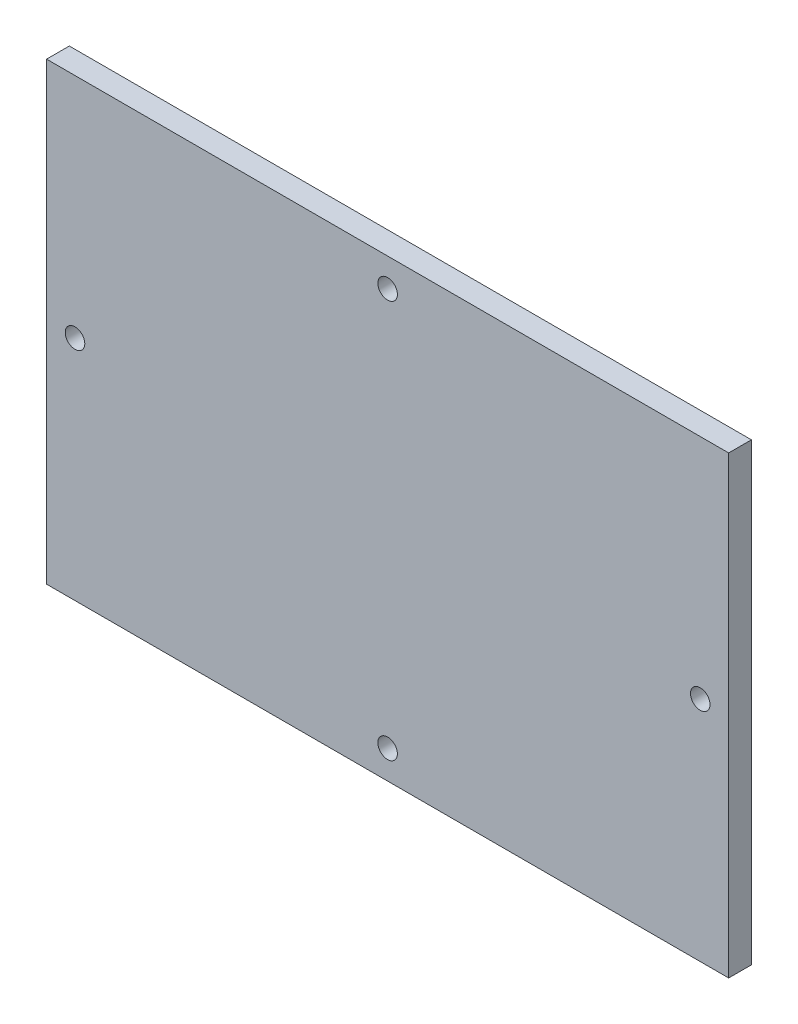
ISO-10303-21;
HEADER;
FILE_DESCRIPTION(('STEP AP214'),'2;1');
FILE_NAME('part.step','',(''),(''),'','','');
FILE_SCHEMA(('AUTOMOTIVE_DESIGN { 1 0 10303 214 1 1 1 1 }'));
ENDSEC;
DATA;
#1=APPLICATION_CONTEXT('core data for automotive mechanical design processes');
#2=APPLICATION_PROTOCOL_DEFINITION('international standard','automotive_design',2000,#1);
#3=PRODUCT_CONTEXT('',#1,'mechanical');
#4=PRODUCT('Part','Part','',(#3));
#5=PRODUCT_RELATED_PRODUCT_CATEGORY('part','',(#4));
#6=PRODUCT_DEFINITION_FORMATION('','',#4);
#7=PRODUCT_DEFINITION_CONTEXT('part definition',#1,'design');
#8=PRODUCT_DEFINITION('design','',#6,#7);
#9=PRODUCT_DEFINITION_SHAPE('','',#8);
#10=(LENGTH_UNIT() NAMED_UNIT(*) SI_UNIT(.MILLI.,.METRE.));
#11=(NAMED_UNIT(*) PLANE_ANGLE_UNIT() SI_UNIT($,.RADIAN.));
#12=(NAMED_UNIT(*) SI_UNIT($,.STERADIAN.) SOLID_ANGLE_UNIT());
#13=UNCERTAINTY_MEASURE_WITH_UNIT(LENGTH_MEASURE(1.E-05),#10,'distance_accuracy_value','');
#14=(GEOMETRIC_REPRESENTATION_CONTEXT(3) GLOBAL_UNCERTAINTY_ASSIGNED_CONTEXT((#13)) GLOBAL_UNIT_ASSIGNED_CONTEXT((#10,
#11,#12)) REPRESENTATION_CONTEXT('',''));
#15=CARTESIAN_POINT('',(0.,0.,0.));
#16=DIRECTION('',(0.,0.,1.));
#17=DIRECTION('',(1.,0.,0.));
#18=AXIS2_PLACEMENT_3D('',#15,#16,#17);
#19=CARTESIAN_POINT('',(-38.1,-25.4,2.54));
#20=DIRECTION('',(1.,0.,0.));
#21=DIRECTION('',(0.,0.,-1.));
#22=AXIS2_PLACEMENT_3D('',#19,#20,#21);
#23=PLANE('',#22);
#24=DIRECTION('',(0.,-1.,0.));
#25=VECTOR('',#24,1.);
#26=CARTESIAN_POINT('',(-38.1,-25.4,0.));
#27=LINE('',#26,#25);
#28=CARTESIAN_POINT('',(-38.1,25.4,0.));
#29=VERTEX_POINT('',#28);
#30=CARTESIAN_POINT('',(-38.1,-25.4,0.));
#31=VERTEX_POINT('',#30);
#32=EDGE_CURVE('E114',#29,#31,#27,.T.);
#33=ORIENTED_EDGE('',*,*,#32,.T.);
#34=DIRECTION('',(0.,0.,-1.));
#35=VECTOR('',#34,1.);
#36=CARTESIAN_POINT('',(-38.1,-25.4,2.54));
#37=LINE('',#36,#35);
#38=CARTESIAN_POINT('',(-38.1,-25.4,2.54));
#39=VERTEX_POINT('',#38);
#40=EDGE_CURVE('E11',#39,#31,#37,.T.);
#41=ORIENTED_EDGE('',*,*,#40,.F.);
#42=DIRECTION('',(0.,-1.,0.));
#43=VECTOR('',#42,1.);
#44=CARTESIAN_POINT('',(-38.1,-25.4,2.54));
#45=LINE('',#44,#43);
#46=CARTESIAN_POINT('',(-38.1,25.4,2.54));
#47=VERTEX_POINT('',#46);
#48=EDGE_CURVE('E100',#47,#39,#45,.T.);
#49=ORIENTED_EDGE('',*,*,#48,.F.);
#50=DIRECTION('',(0.,0.,-1.));
#51=VECTOR('',#50,1.);
#52=CARTESIAN_POINT('',(-38.1,25.4,2.54));
#53=LINE('',#52,#51);
#54=EDGE_CURVE('E108',#47,#29,#53,.T.);
#55=ORIENTED_EDGE('',*,*,#54,.T.);
#56=EDGE_LOOP('',(#33,#41,#49,#55));
#57=FACE_BOUND('',#56,.T.);
#58=ADVANCED_FACE('F44',(#57),#23,.F.);
#59=CARTESIAN_POINT('',(38.1,-25.4,2.54));
#60=DIRECTION('',(0.,1.,0.));
#61=DIRECTION('',(-1.,0.,0.));
#62=AXIS2_PLACEMENT_3D('',#59,#60,#61);
#63=PLANE('',#62);
#64=DIRECTION('',(1.,0.,0.));
#65=VECTOR('',#64,1.);
#66=CARTESIAN_POINT('',(38.1,-25.4,0.));
#67=LINE('',#66,#65);
#68=CARTESIAN_POINT('',(38.1,-25.4,0.));
#69=VERTEX_POINT('',#68);
#70=EDGE_CURVE('E105',#31,#69,#67,.T.);
#71=ORIENTED_EDGE('',*,*,#70,.T.);
#72=DIRECTION('',(0.,0.,-1.));
#73=VECTOR('',#72,1.);
#74=CARTESIAN_POINT('',(38.1,-25.4,2.54));
#75=LINE('',#74,#73);
#76=CARTESIAN_POINT('',(38.1,-25.4,2.54));
#77=VERTEX_POINT('',#76);
#78=EDGE_CURVE('E53',#77,#69,#75,.T.);
#79=ORIENTED_EDGE('',*,*,#78,.F.);
#80=DIRECTION('',(1.,0.,0.));
#81=VECTOR('',#80,1.);
#82=CARTESIAN_POINT('',(38.1,-25.4,2.54));
#83=LINE('',#82,#81);
#84=EDGE_CURVE('E95',#39,#77,#83,.T.);
#85=ORIENTED_EDGE('',*,*,#84,.F.);
#86=ORIENTED_EDGE('',*,*,#40,.T.);
#87=EDGE_LOOP('',(#71,#79,#85,#86));
#88=FACE_BOUND('',#87,.T.);
#89=ADVANCED_FACE('F101',(#88),#63,.F.);
#90=CARTESIAN_POINT('',(38.1,-25.4,2.54));
#91=DIRECTION('',(-1.,0.,0.));
#92=DIRECTION('',(0.,0.,1.));
#93=AXIS2_PLACEMENT_3D('',#90,#91,#92);
#94=PLANE('',#93);
#95=DIRECTION('',(0.,1.,0.));
#96=VECTOR('',#95,1.);
#97=CARTESIAN_POINT('',(38.1,-25.4,0.));
#98=LINE('',#97,#96);
#99=CARTESIAN_POINT('',(38.1,25.4,0.));
#100=VERTEX_POINT('',#99);
#101=EDGE_CURVE('E76',#69,#100,#98,.T.);
#102=ORIENTED_EDGE('',*,*,#101,.T.);
#103=DIRECTION('',(0.,0.,-1.));
#104=VECTOR('',#103,1.);
#105=CARTESIAN_POINT('',(38.1,25.4,2.54));
#106=LINE('',#105,#104);
#107=CARTESIAN_POINT('',(38.1,25.4,2.54));
#108=VERTEX_POINT('',#107);
#109=EDGE_CURVE('E102',#108,#100,#106,.T.);
#110=ORIENTED_EDGE('',*,*,#109,.F.);
#111=DIRECTION('',(0.,1.,0.));
#112=VECTOR('',#111,1.);
#113=CARTESIAN_POINT('',(38.1,-25.4,2.54));
#114=LINE('',#113,#112);
#115=EDGE_CURVE('E92',#77,#108,#114,.T.);
#116=ORIENTED_EDGE('',*,*,#115,.F.);
#117=ORIENTED_EDGE('',*,*,#78,.T.);
#118=EDGE_LOOP('',(#102,#110,#116,#117));
#119=FACE_BOUND('',#118,.T.);
#120=ADVANCED_FACE('F104',(#119),#94,.F.);
#121=CARTESIAN_POINT('',(38.1,25.4,2.54));
#122=DIRECTION('',(0.,-1.,0.));
#123=DIRECTION('',(1.,0.,0.));
#124=AXIS2_PLACEMENT_3D('',#121,#122,#123);
#125=PLANE('',#124);
#126=DIRECTION('',(-1.,0.,0.));
#127=VECTOR('',#126,1.);
#128=CARTESIAN_POINT('',(38.1,25.4,0.));
#129=LINE('',#128,#127);
#130=EDGE_CURVE('E81',#100,#29,#129,.T.);
#131=ORIENTED_EDGE('',*,*,#130,.T.);
#132=ORIENTED_EDGE('',*,*,#54,.F.);
#133=DIRECTION('',(-1.,0.,0.));
#134=VECTOR('',#133,1.);
#135=CARTESIAN_POINT('',(38.1,25.4,2.54));
#136=LINE('',#135,#134);
#137=EDGE_CURVE('E65',#108,#47,#136,.T.);
#138=ORIENTED_EDGE('',*,*,#137,.F.);
#139=ORIENTED_EDGE('',*,*,#109,.T.);
#140=EDGE_LOOP('',(#131,#132,#138,#139));
#141=FACE_BOUND('',#140,.T.);
#142=ADVANCED_FACE('F130',(#141),#125,.F.);
#143=CARTESIAN_POINT('',(0.,0.,2.54));
#144=DIRECTION('',(0.,0.,1.));
#145=DIRECTION('',(1.,0.,0.));
#146=AXIS2_PLACEMENT_3D('',#143,#144,#145);
#147=PLANE('',#146);
#148=CARTESIAN_POINT('',(-34.925,0.,2.54));
#149=DIRECTION('',(0.,0.,1.));
#150=DIRECTION('',(1.,0.,0.));
#151=AXIS2_PLACEMENT_3D('',#148,#149,#150);
#152=CIRCLE('',#151,1.0922);
#153=CARTESIAN_POINT('',(-33.8328,0.,2.54));
#154=VERTEX_POINT('',#153);
#155=EDGE_CURVE('E158',#154,#154,#152,.T.);
#156=ORIENTED_EDGE('',*,*,#155,.F.);
#157=EDGE_LOOP('',(#156));
#158=FACE_BOUND('',#157,.T.);
#159=CARTESIAN_POINT('',(34.925,0.,2.54));
#160=DIRECTION('',(0.,0.,1.));
#161=DIRECTION('',(-1.,0.,0.));
#162=AXIS2_PLACEMENT_3D('',#159,#160,#161);
#163=CIRCLE('',#162,1.0922);
#164=CARTESIAN_POINT('',(33.8328,0.,2.54));
#165=VERTEX_POINT('',#164);
#166=EDGE_CURVE('E152',#165,#165,#163,.T.);
#167=ORIENTED_EDGE('',*,*,#166,.F.);
#168=EDGE_LOOP('',(#167));
#169=FACE_BOUND('',#168,.T.);
#170=CARTESIAN_POINT('',(0.,-22.225,2.54));
#171=DIRECTION('',(0.,0.,1.));
#172=DIRECTION('',(1.,0.,0.));
#173=AXIS2_PLACEMENT_3D('',#170,#171,#172);
#174=CIRCLE('',#173,1.0922);
#175=CARTESIAN_POINT('',(1.0922,-22.225,2.54));
#176=VERTEX_POINT('',#175);
#177=EDGE_CURVE('E148',#176,#176,#174,.T.);
#178=ORIENTED_EDGE('',*,*,#177,.F.);
#179=EDGE_LOOP('',(#178));
#180=FACE_BOUND('',#179,.T.);
#181=CARTESIAN_POINT('',(0.,22.225,2.54));
#182=DIRECTION('',(0.,0.,1.));
#183=DIRECTION('',(-1.,0.,0.));
#184=AXIS2_PLACEMENT_3D('',#181,#182,#183);
#185=CIRCLE('',#184,1.0922);
#186=CARTESIAN_POINT('',(-1.09220000000003,22.225,2.54));
#187=VERTEX_POINT('',#186);
#188=EDGE_CURVE('E138',#187,#187,#185,.T.);
#189=ORIENTED_EDGE('',*,*,#188,.F.);
#190=EDGE_LOOP('',(#189));
#191=FACE_BOUND('',#190,.T.);
#192=ORIENTED_EDGE('',*,*,#48,.T.);
#193=ORIENTED_EDGE('',*,*,#84,.T.);
#194=ORIENTED_EDGE('',*,*,#115,.T.);
#195=ORIENTED_EDGE('',*,*,#137,.T.);
#196=EDGE_LOOP('',(#192,#193,#194,#195));
#197=FACE_BOUND('',#196,.T.);
#198=ADVANCED_FACE('F91',(#158,#169,#180,#191,#197),#147,.T.);
#199=CARTESIAN_POINT('',(0.,0.,0.));
#200=DIRECTION('',(0.,0.,1.));
#201=DIRECTION('',(1.,0.,0.));
#202=AXIS2_PLACEMENT_3D('',#199,#200,#201);
#203=PLANE('',#202);
#204=CARTESIAN_POINT('',(-34.925,0.,0.));
#205=DIRECTION('',(0.,0.,1.));
#206=DIRECTION('',(1.,0.,0.));
#207=AXIS2_PLACEMENT_3D('',#204,#205,#206);
#208=CIRCLE('',#207,1.0922);
#209=CARTESIAN_POINT('',(-33.8328,0.,0.));
#210=VERTEX_POINT('',#209);
#211=EDGE_CURVE('E120',#210,#210,#208,.T.);
#212=ORIENTED_EDGE('',*,*,#211,.T.);
#213=EDGE_LOOP('',(#212));
#214=FACE_BOUND('',#213,.T.);
#215=CARTESIAN_POINT('',(34.925,0.,0.));
#216=DIRECTION('',(0.,0.,1.));
#217=DIRECTION('',(-1.,0.,0.));
#218=AXIS2_PLACEMENT_3D('',#215,#216,#217);
#219=CIRCLE('',#218,1.0922);
#220=CARTESIAN_POINT('',(33.8328,0.,0.));
#221=VERTEX_POINT('',#220);
#222=EDGE_CURVE('E147',#221,#221,#219,.T.);
#223=ORIENTED_EDGE('',*,*,#222,.T.);
#224=EDGE_LOOP('',(#223));
#225=FACE_BOUND('',#224,.T.);
#226=CARTESIAN_POINT('',(0.,-22.225,0.));
#227=DIRECTION('',(0.,0.,1.));
#228=DIRECTION('',(1.,0.,0.));
#229=AXIS2_PLACEMENT_3D('',#226,#227,#228);
#230=CIRCLE('',#229,1.0922);
#231=CARTESIAN_POINT('',(1.0922,-22.225,0.));
#232=VERTEX_POINT('',#231);
#233=EDGE_CURVE('E142',#232,#232,#230,.T.);
#234=ORIENTED_EDGE('',*,*,#233,.T.);
#235=EDGE_LOOP('',(#234));
#236=FACE_BOUND('',#235,.T.);
#237=CARTESIAN_POINT('',(0.,22.225,0.));
#238=DIRECTION('',(0.,0.,1.));
#239=DIRECTION('',(-1.,0.,0.));
#240=AXIS2_PLACEMENT_3D('',#237,#238,#239);
#241=CIRCLE('',#240,1.0922);
#242=CARTESIAN_POINT('',(-1.09220000000003,22.225,0.));
#243=VERTEX_POINT('',#242);
#244=EDGE_CURVE('E131',#243,#243,#241,.T.);
#245=ORIENTED_EDGE('',*,*,#244,.T.);
#246=EDGE_LOOP('',(#245));
#247=FACE_BOUND('',#246,.T.);
#248=ORIENTED_EDGE('',*,*,#32,.F.);
#249=ORIENTED_EDGE('',*,*,#130,.F.);
#250=ORIENTED_EDGE('',*,*,#101,.F.);
#251=ORIENTED_EDGE('',*,*,#70,.F.);
#252=EDGE_LOOP('',(#248,#249,#250,#251));
#253=FACE_BOUND('',#252,.T.);
#254=ADVANCED_FACE('F128',(#214,#225,#236,#247,#253),#203,.F.);
#255=CARTESIAN_POINT('',(0.,22.225,0.));
#256=DIRECTION('',(0.,0.,1.));
#257=DIRECTION('',(1.,0.,0.));
#258=AXIS2_PLACEMENT_3D('',#255,#256,#257);
#259=CYLINDRICAL_SURFACE('',#258,1.0922);
#260=ORIENTED_EDGE('',*,*,#244,.F.);
#261=EDGE_LOOP('',(#260));
#262=FACE_BOUND('',#261,.T.);
#263=ORIENTED_EDGE('',*,*,#188,.T.);
#264=EDGE_LOOP('',(#263));
#265=FACE_BOUND('',#264,.T.);
#266=ADVANCED_FACE('F184',(#262,#265),#259,.F.);
#267=CARTESIAN_POINT('',(0.,-22.225,0.));
#268=DIRECTION('',(0.,0.,1.));
#269=DIRECTION('',(1.,0.,0.));
#270=AXIS2_PLACEMENT_3D('',#267,#268,#269);
#271=CYLINDRICAL_SURFACE('',#270,1.0922);
#272=ORIENTED_EDGE('',*,*,#233,.F.);
#273=EDGE_LOOP('',(#272));
#274=FACE_BOUND('',#273,.T.);
#275=ORIENTED_EDGE('',*,*,#177,.T.);
#276=EDGE_LOOP('',(#275));
#277=FACE_BOUND('',#276,.T.);
#278=ADVANCED_FACE('F187',(#274,#277),#271,.F.);
#279=CARTESIAN_POINT('',(34.925,0.,0.));
#280=DIRECTION('',(0.,0.,1.));
#281=DIRECTION('',(1.,0.,0.));
#282=AXIS2_PLACEMENT_3D('',#279,#280,#281);
#283=CYLINDRICAL_SURFACE('',#282,1.0922);
#284=ORIENTED_EDGE('',*,*,#222,.F.);
#285=EDGE_LOOP('',(#284));
#286=FACE_BOUND('',#285,.T.);
#287=ORIENTED_EDGE('',*,*,#166,.T.);
#288=EDGE_LOOP('',(#287));
#289=FACE_BOUND('',#288,.T.);
#290=ADVANCED_FACE('F172',(#286,#289),#283,.F.);
#291=CARTESIAN_POINT('',(-34.925,0.,0.));
#292=DIRECTION('',(0.,0.,1.));
#293=DIRECTION('',(1.,0.,0.));
#294=AXIS2_PLACEMENT_3D('',#291,#292,#293);
#295=CYLINDRICAL_SURFACE('',#294,1.0922);
#296=ORIENTED_EDGE('',*,*,#211,.F.);
#297=EDGE_LOOP('',(#296));
#298=FACE_BOUND('',#297,.T.);
#299=ORIENTED_EDGE('',*,*,#155,.T.);
#300=EDGE_LOOP('',(#299));
#301=FACE_BOUND('',#300,.T.);
#302=ADVANCED_FACE('F169',(#298,#301),#295,.F.);
#303=CLOSED_SHELL('',(#58,#89,#120,#142,#198,#254,#266,#278,#290,#302));
#304=MANIFOLD_SOLID_BREP('B2',#303);
#305=ADVANCED_BREP_SHAPE_REPRESENTATION('',(#18,#304),#14);
#306=SHAPE_DEFINITION_REPRESENTATION(#9,#305);
ENDSEC;
END-ISO-10303-21;
